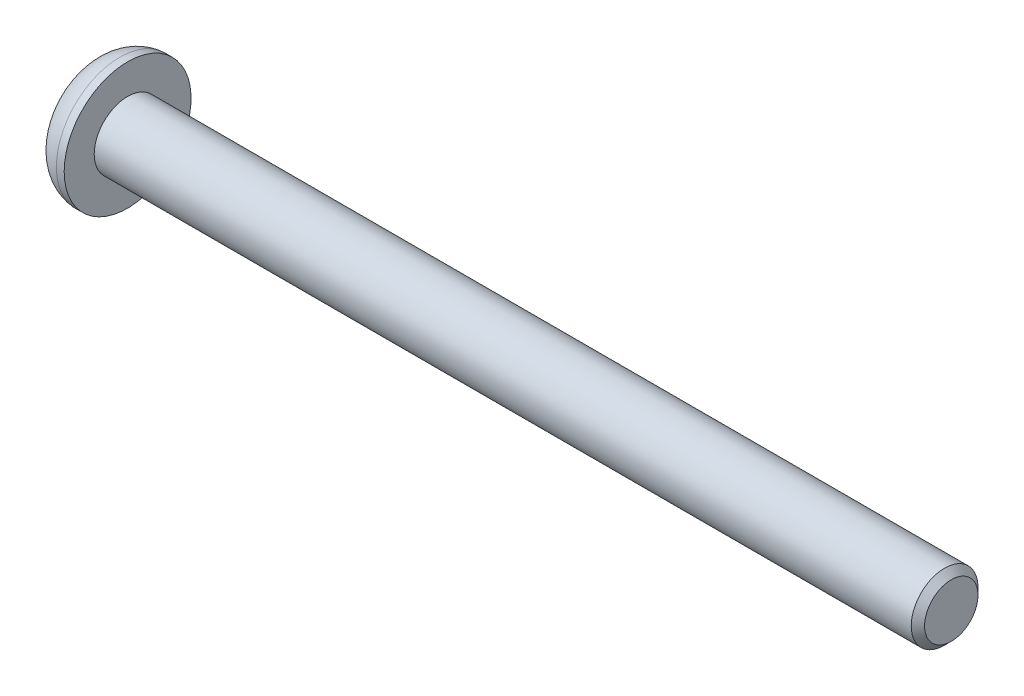
ISO-10303-21;
HEADER;
FILE_DESCRIPTION(('STEP AP214'),'2;1');
FILE_NAME('part.step','',(''),(''),'','','');
FILE_SCHEMA(('AUTOMOTIVE_DESIGN { 1 0 10303 214 1 1 1 1 }'));
ENDSEC;
DATA;
#1=APPLICATION_CONTEXT('core data for automotive mechanical design processes');
#2=APPLICATION_PROTOCOL_DEFINITION('international standard','automotive_design',2000,#1);
#3=PRODUCT_CONTEXT('',#1,'mechanical');
#4=PRODUCT('Part','Part','',(#3));
#5=PRODUCT_RELATED_PRODUCT_CATEGORY('part','',(#4));
#6=PRODUCT_DEFINITION_FORMATION('','',#4);
#7=PRODUCT_DEFINITION_CONTEXT('part definition',#1,'design');
#8=PRODUCT_DEFINITION('design','',#6,#7);
#9=PRODUCT_DEFINITION_SHAPE('','',#8);
#10=(LENGTH_UNIT() NAMED_UNIT(*) SI_UNIT(.MILLI.,.METRE.));
#11=(NAMED_UNIT(*) PLANE_ANGLE_UNIT() SI_UNIT($,.RADIAN.));
#12=(NAMED_UNIT(*) SI_UNIT($,.STERADIAN.) SOLID_ANGLE_UNIT());
#13=UNCERTAINTY_MEASURE_WITH_UNIT(LENGTH_MEASURE(1.E-05),#10,'distance_accuracy_value','');
#14=(GEOMETRIC_REPRESENTATION_CONTEXT(3) GLOBAL_UNCERTAINTY_ASSIGNED_CONTEXT((#13)) GLOBAL_UNIT_ASSIGNED_CONTEXT((#10,
#11,#12)) REPRESENTATION_CONTEXT('',''));
#15=CARTESIAN_POINT('',(0.,0.,0.));
#16=DIRECTION('',(0.,0.,1.));
#17=DIRECTION('',(1.,0.,0.));
#18=AXIS2_PLACEMENT_3D('',#15,#16,#17);
#19=CARTESIAN_POINT('',(-17.8951523683545,0.,0.));
#20=DIRECTION('',(1.,0.,0.));
#21=DIRECTION('',(0.,0.,-1.));
#22=AXIS2_PLACEMENT_3D('',#19,#20,#21);
#23=PLANE('',#22);
#24=DIRECTION('',(0.,-0.5,-0.866025403784439));
#25=VECTOR('',#24,1.);
#26=CARTESIAN_POINT('',(-17.8951523683545,1.15470053837925,0.));
#27=LINE('',#26,#25);
#28=CARTESIAN_POINT('',(-17.8951523683545,1.15470053837925,0.));
#29=VERTEX_POINT('',#28);
#30=CARTESIAN_POINT('',(-17.8951523683545,0.577350269189626,-1.));
#31=VERTEX_POINT('',#30);
#32=EDGE_CURVE('E127',#29,#31,#27,.T.);
#33=ORIENTED_EDGE('',*,*,#32,.F.);
#34=DIRECTION('',(0.,0.5,-0.866025403784439));
#35=VECTOR('',#34,1.);
#36=CARTESIAN_POINT('',(-17.8951523683545,0.577350269189626,1.));
#37=LINE('',#36,#35);
#38=CARTESIAN_POINT('',(-17.8951523683545,0.577350269189626,1.));
#39=VERTEX_POINT('',#38);
#40=EDGE_CURVE('E53',#39,#29,#37,.T.);
#41=ORIENTED_EDGE('',*,*,#40,.F.);
#42=DIRECTION('',(0.,1.,0.));
#43=VECTOR('',#42,1.);
#44=CARTESIAN_POINT('',(-17.8951523683545,-0.577350269189626,1.));
#45=LINE('',#44,#43);
#46=CARTESIAN_POINT('',(-17.8951523683545,-0.577350269189626,1.));
#47=VERTEX_POINT('',#46);
#48=EDGE_CURVE('E136',#47,#39,#45,.T.);
#49=ORIENTED_EDGE('',*,*,#48,.F.);
#50=DIRECTION('',(0.,0.5,0.866025403784439));
#51=VECTOR('',#50,1.);
#52=CARTESIAN_POINT('',(-17.8951523683545,-1.15470053837925,0.));
#53=LINE('',#52,#51);
#54=CARTESIAN_POINT('',(-17.8951523683545,-1.15470053837925,0.));
#55=VERTEX_POINT('',#54);
#56=EDGE_CURVE('E134',#55,#47,#53,.T.);
#57=ORIENTED_EDGE('',*,*,#56,.F.);
#58=DIRECTION('',(0.,-0.5,0.866025403784439));
#59=VECTOR('',#58,1.);
#60=CARTESIAN_POINT('',(-17.8951523683545,-0.577350269189626,-1.));
#61=LINE('',#60,#59);
#62=CARTESIAN_POINT('',(-17.8951523683545,-0.577350269189626,-1.));
#63=VERTEX_POINT('',#62);
#64=EDGE_CURVE('E101',#63,#55,#61,.T.);
#65=ORIENTED_EDGE('',*,*,#64,.F.);
#66=DIRECTION('',(0.,-1.,0.));
#67=VECTOR('',#66,1.);
#68=CARTESIAN_POINT('',(-17.8951523683545,0.577350269189626,-1.));
#69=LINE('',#68,#67);
#70=EDGE_CURVE('E130',#31,#63,#69,.T.);
#71=ORIENTED_EDGE('',*,*,#70,.F.);
#72=EDGE_LOOP('',(#33,#41,#49,#57,#65,#71));
#73=FACE_BOUND('',#72,.T.);
#74=CARTESIAN_POINT('',(-17.8951523683545,0.,0.));
#75=DIRECTION('',(-1.,0.,0.));
#76=DIRECTION('',(0.,0.,1.));
#77=AXIS2_PLACEMENT_3D('',#74,#75,#76);
#78=CIRCLE('',#77,1.425);
#79=CARTESIAN_POINT('',(-17.8951523683545,0.,1.425));
#80=VERTEX_POINT('',#79);
#81=EDGE_CURVE('E11',#80,#80,#78,.T.);
#82=ORIENTED_EDGE('',*,*,#81,.T.);
#83=EDGE_LOOP('',(#82));
#84=FACE_BOUND('',#83,.T.);
#85=ADVANCED_FACE('F39',(#73,#84),#23,.F.);
#86=CARTESIAN_POINT('',(-16.4641427529699,0.,0.));
#87=DIRECTION('',(-1.,0.,0.));
#88=DIRECTION('',(0.,0.,1.));
#89=AXIS2_PLACEMENT_3D('',#86,#87,#88);
#90=DEGENERATE_TOROIDAL_SURFACE('',#89,1.425,1.43100961538462,.T.);
#91=ORIENTED_EDGE('',*,*,#81,.F.);
#92=EDGE_LOOP('',(#91));
#93=FACE_BOUND('',#92,.T.);
#94=CARTESIAN_POINT('',(-16.5951523683545,0.,0.));
#95=DIRECTION('',(-1.,0.,0.));
#96=DIRECTION('',(0.,0.,1.));
#97=AXIS2_PLACEMENT_3D('',#94,#95,#96);
#98=CIRCLE('',#97,2.85);
#99=CARTESIAN_POINT('',(-16.5951523683545,0.,2.85));
#100=VERTEX_POINT('',#99);
#101=EDGE_CURVE('E46',#100,#100,#98,.T.);
#102=ORIENTED_EDGE('',*,*,#101,.T.);
#103=EDGE_LOOP('',(#102));
#104=FACE_BOUND('',#103,.T.);
#105=ADVANCED_FACE('F159',(#93,#104),#90,.T.);
#106=CARTESIAN_POINT('',(-8.74874301025164,0.,0.));
#107=DIRECTION('',(-1.,0.,0.));
#108=DIRECTION('',(0.,0.,1.));
#109=AXIS2_PLACEMENT_3D('',#106,#107,#108);
#110=CYLINDRICAL_SURFACE('',#109,2.85);
#111=ORIENTED_EDGE('',*,*,#101,.F.);
#112=EDGE_LOOP('',(#111));
#113=FACE_BOUND('',#112,.T.);
#114=CARTESIAN_POINT('',(-16.2451523683545,0.,0.));
#115=DIRECTION('',(-1.,0.,0.));
#116=DIRECTION('',(0.,0.,1.));
#117=AXIS2_PLACEMENT_3D('',#114,#115,#116);
#118=CIRCLE('',#117,2.85);
#119=CARTESIAN_POINT('',(-16.2451523683545,0.,2.85));
#120=VERTEX_POINT('',#119);
#121=EDGE_CURVE('E154',#120,#120,#118,.T.);
#122=ORIENTED_EDGE('',*,*,#121,.T.);
#123=EDGE_LOOP('',(#122));
#124=FACE_BOUND('',#123,.T.);
#125=ADVANCED_FACE('F161',(#113,#124),#110,.T.);
#126=CARTESIAN_POINT('',(-16.2451523683545,2.85,0.));
#127=DIRECTION('',(-1.,0.,0.));
#128=DIRECTION('',(0.,0.,1.));
#129=AXIS2_PLACEMENT_3D('',#126,#127,#128);
#130=PLANE('',#129);
#131=ORIENTED_EDGE('',*,*,#121,.F.);
#132=EDGE_LOOP('',(#131));
#133=FACE_BOUND('',#132,.T.);
#134=CARTESIAN_POINT('',(-16.2451523683545,0.,0.));
#135=DIRECTION('',(-1.,0.,0.));
#136=DIRECTION('',(0.,0.,1.));
#137=AXIS2_PLACEMENT_3D('',#134,#135,#136);
#138=CIRCLE('',#137,1.5);
#139=CARTESIAN_POINT('',(-16.2451523683545,0.,1.5));
#140=VERTEX_POINT('',#139);
#141=EDGE_CURVE('E151',#140,#140,#138,.T.);
#142=ORIENTED_EDGE('',*,*,#141,.T.);
#143=EDGE_LOOP('',(#142));
#144=FACE_BOUND('',#143,.T.);
#145=ADVANCED_FACE('F164',(#133,#144),#130,.F.);
#146=CARTESIAN_POINT('',(-8.74874301025164,0.,0.));
#147=DIRECTION('',(-1.,0.,0.));
#148=DIRECTION('',(0.,0.,1.));
#149=AXIS2_PLACEMENT_3D('',#146,#147,#148);
#150=CYLINDRICAL_SURFACE('',#149,1.5);
#151=ORIENTED_EDGE('',*,*,#141,.F.);
#152=EDGE_LOOP('',(#151));
#153=FACE_BOUND('',#152,.T.);
#154=CARTESIAN_POINT('',(20.4548476316455,0.,0.));
#155=DIRECTION('',(-1.,0.,0.));
#156=DIRECTION('',(0.,0.,1.));
#157=AXIS2_PLACEMENT_3D('',#154,#155,#156);
#158=CIRCLE('',#157,1.5);
#159=CARTESIAN_POINT('',(20.4548476316455,0.,1.5));
#160=VERTEX_POINT('',#159);
#161=EDGE_CURVE('E148',#160,#160,#158,.T.);
#162=ORIENTED_EDGE('',*,*,#161,.T.);
#163=EDGE_LOOP('',(#162));
#164=FACE_BOUND('',#163,.T.);
#165=ADVANCED_FACE('F170',(#153,#164),#150,.T.);
#166=CARTESIAN_POINT('',(20.7548476316455,0.,0.));
#167=DIRECTION('',(-1.,0.,0.));
#168=DIRECTION('',(0.,0.,1.));
#169=AXIS2_PLACEMENT_3D('',#166,#167,#168);
#170=CONICAL_SURFACE('',#169,1.2,0.78539816339745);
#171=ORIENTED_EDGE('',*,*,#161,.F.);
#172=EDGE_LOOP('',(#171));
#173=FACE_BOUND('',#172,.T.);
#174=CARTESIAN_POINT('',(20.7548476316455,0.,0.));
#175=DIRECTION('',(-1.,0.,0.));
#176=DIRECTION('',(0.,0.,1.));
#177=AXIS2_PLACEMENT_3D('',#174,#175,#176);
#178=CIRCLE('',#177,1.2);
#179=CARTESIAN_POINT('',(20.7548476316455,0.,1.2));
#180=VERTEX_POINT('',#179);
#181=EDGE_CURVE('E140',#180,#180,#178,.T.);
#182=ORIENTED_EDGE('',*,*,#181,.T.);
#183=EDGE_LOOP('',(#182));
#184=FACE_BOUND('',#183,.T.);
#185=ADVANCED_FACE('F176',(#173,#184),#170,.T.);
#186=CARTESIAN_POINT('',(20.7548476316455,1.2,0.));
#187=DIRECTION('',(-1.,0.,0.));
#188=DIRECTION('',(0.,0.,1.));
#189=AXIS2_PLACEMENT_3D('',#186,#187,#188);
#190=PLANE('',#189);
#191=ORIENTED_EDGE('',*,*,#181,.F.);
#192=EDGE_LOOP('',(#191));
#193=FACE_BOUND('',#192,.T.);
#194=ADVANCED_FACE('F182',(#193),#190,.F.);
#195=CARTESIAN_POINT('',(-16.8951523683545,0.577350269189626,1.));
#196=DIRECTION('',(0.,0.866025403784439,0.5));
#197=DIRECTION('',(0.,-0.5,0.866025403784439));
#198=AXIS2_PLACEMENT_3D('',#195,#196,#197);
#199=PLANE('',#198);
#200=ORIENTED_EDGE('',*,*,#40,.T.);
#201=DIRECTION('',(-1.,0.,0.));
#202=VECTOR('',#201,1.);
#203=CARTESIAN_POINT('',(-16.8951523683545,1.15470053837925,0.));
#204=LINE('',#203,#202);
#205=CARTESIAN_POINT('',(-16.8951523683545,1.15470053837925,0.));
#206=VERTEX_POINT('',#205);
#207=EDGE_CURVE('E83',#206,#29,#204,.T.);
#208=ORIENTED_EDGE('',*,*,#207,.F.);
#209=DIRECTION('',(0.,0.5,-0.866025403784439));
#210=VECTOR('',#209,1.);
#211=CARTESIAN_POINT('',(-16.8951523683545,0.577350269189626,1.));
#212=LINE('',#211,#210);
#213=CARTESIAN_POINT('',(-16.8951523683545,0.577350269189626,1.));
#214=VERTEX_POINT('',#213);
#215=EDGE_CURVE('E138',#214,#206,#212,.T.);
#216=ORIENTED_EDGE('',*,*,#215,.F.);
#217=DIRECTION('',(-1.,0.,0.));
#218=VECTOR('',#217,1.);
#219=CARTESIAN_POINT('',(-16.8951523683545,0.577350269189626,1.));
#220=LINE('',#219,#218);
#221=EDGE_CURVE('E61',#214,#39,#220,.T.);
#222=ORIENTED_EDGE('',*,*,#221,.T.);
#223=EDGE_LOOP('',(#200,#208,#216,#222));
#224=FACE_BOUND('',#223,.T.);
#225=ADVANCED_FACE('F187',(#224),#199,.F.);
#226=CARTESIAN_POINT('',(-16.8951523683545,-0.577350269189626,1.));
#227=DIRECTION('',(0.,0.,1.));
#228=DIRECTION('',(0.,-1.,0.));
#229=AXIS2_PLACEMENT_3D('',#226,#227,#228);
#230=PLANE('',#229);
#231=ORIENTED_EDGE('',*,*,#48,.T.);
#232=ORIENTED_EDGE('',*,*,#221,.F.);
#233=DIRECTION('',(0.,1.,0.));
#234=VECTOR('',#233,1.);
#235=CARTESIAN_POINT('',(-16.8951523683545,-0.577350269189626,1.));
#236=LINE('',#235,#234);
#237=CARTESIAN_POINT('',(-16.8951523683545,-0.577350269189626,1.));
#238=VERTEX_POINT('',#237);
#239=EDGE_CURVE('E113',#238,#214,#236,.T.);
#240=ORIENTED_EDGE('',*,*,#239,.F.);
#241=DIRECTION('',(-1.,0.,0.));
#242=VECTOR('',#241,1.);
#243=CARTESIAN_POINT('',(-16.8951523683545,-0.577350269189626,1.));
#244=LINE('',#243,#242);
#245=EDGE_CURVE('E105',#238,#47,#244,.T.);
#246=ORIENTED_EDGE('',*,*,#245,.T.);
#247=EDGE_LOOP('',(#231,#232,#240,#246));
#248=FACE_BOUND('',#247,.T.);
#249=ADVANCED_FACE('F192',(#248),#230,.F.);
#250=CARTESIAN_POINT('',(-16.8951523683545,-1.15470053837925,0.));
#251=DIRECTION('',(0.,-0.866025403784439,0.5));
#252=DIRECTION('',(0.,-0.5,-0.866025403784439));
#253=AXIS2_PLACEMENT_3D('',#250,#251,#252);
#254=PLANE('',#253);
#255=ORIENTED_EDGE('',*,*,#56,.T.);
#256=ORIENTED_EDGE('',*,*,#245,.F.);
#257=DIRECTION('',(0.,0.5,0.866025403784439));
#258=VECTOR('',#257,1.);
#259=CARTESIAN_POINT('',(-16.8951523683545,-1.15470053837925,0.));
#260=LINE('',#259,#258);
#261=CARTESIAN_POINT('',(-16.8951523683545,-1.15470053837925,0.));
#262=VERTEX_POINT('',#261);
#263=EDGE_CURVE('E109',#262,#238,#260,.T.);
#264=ORIENTED_EDGE('',*,*,#263,.F.);
#265=DIRECTION('',(-1.,0.,0.));
#266=VECTOR('',#265,1.);
#267=CARTESIAN_POINT('',(-16.8951523683545,-1.15470053837925,0.));
#268=LINE('',#267,#266);
#269=EDGE_CURVE('E94',#262,#55,#268,.T.);
#270=ORIENTED_EDGE('',*,*,#269,.T.);
#271=EDGE_LOOP('',(#255,#256,#264,#270));
#272=FACE_BOUND('',#271,.T.);
#273=ADVANCED_FACE('F110',(#272),#254,.F.);
#274=CARTESIAN_POINT('',(-16.8951523683545,-0.577350269189626,-1.));
#275=DIRECTION('',(0.,-0.866025403784439,-0.5));
#276=DIRECTION('',(0.,0.5,-0.866025403784439));
#277=AXIS2_PLACEMENT_3D('',#274,#275,#276);
#278=PLANE('',#277);
#279=ORIENTED_EDGE('',*,*,#64,.T.);
#280=ORIENTED_EDGE('',*,*,#269,.F.);
#281=DIRECTION('',(0.,-0.5,0.866025403784439));
#282=VECTOR('',#281,1.);
#283=CARTESIAN_POINT('',(-16.8951523683545,-0.577350269189626,-1.));
#284=LINE('',#283,#282);
#285=CARTESIAN_POINT('',(-16.8951523683545,-0.577350269189626,-1.));
#286=VERTEX_POINT('',#285);
#287=EDGE_CURVE('E98',#286,#262,#284,.T.);
#288=ORIENTED_EDGE('',*,*,#287,.F.);
#289=DIRECTION('',(-1.,0.,0.));
#290=VECTOR('',#289,1.);
#291=CARTESIAN_POINT('',(-16.8951523683545,-0.577350269189626,-1.));
#292=LINE('',#291,#290);
#293=EDGE_CURVE('E106',#286,#63,#292,.T.);
#294=ORIENTED_EDGE('',*,*,#293,.T.);
#295=EDGE_LOOP('',(#279,#280,#288,#294));
#296=FACE_BOUND('',#295,.T.);
#297=ADVANCED_FACE('F96',(#296),#278,.F.);
#298=CARTESIAN_POINT('',(-16.8951523683545,0.577350269189626,-1.));
#299=DIRECTION('',(0.,0.,-1.));
#300=DIRECTION('',(-1.,0.,0.));
#301=AXIS2_PLACEMENT_3D('',#298,#299,#300);
#302=PLANE('',#301);
#303=ORIENTED_EDGE('',*,*,#70,.T.);
#304=ORIENTED_EDGE('',*,*,#293,.F.);
#305=DIRECTION('',(0.,-1.,0.));
#306=VECTOR('',#305,1.);
#307=CARTESIAN_POINT('',(-16.8951523683545,0.577350269189626,-1.));
#308=LINE('',#307,#306);
#309=CARTESIAN_POINT('',(-16.8951523683545,0.577350269189626,-1.));
#310=VERTEX_POINT('',#309);
#311=EDGE_CURVE('E119',#310,#286,#308,.T.);
#312=ORIENTED_EDGE('',*,*,#311,.F.);
#313=DIRECTION('',(-1.,0.,0.));
#314=VECTOR('',#313,1.);
#315=CARTESIAN_POINT('',(-16.8951523683545,0.577350269189626,-1.));
#316=LINE('',#315,#314);
#317=EDGE_CURVE('E143',#310,#31,#316,.T.);
#318=ORIENTED_EDGE('',*,*,#317,.T.);
#319=EDGE_LOOP('',(#303,#304,#312,#318));
#320=FACE_BOUND('',#319,.T.);
#321=ADVANCED_FACE('F218',(#320),#302,.F.);
#322=CARTESIAN_POINT('',(-16.8951523683545,1.15470053837925,0.));
#323=DIRECTION('',(0.,0.866025403784439,-0.5));
#324=DIRECTION('',(0.,0.5,0.866025403784439));
#325=AXIS2_PLACEMENT_3D('',#322,#323,#324);
#326=PLANE('',#325);
#327=ORIENTED_EDGE('',*,*,#32,.T.);
#328=ORIENTED_EDGE('',*,*,#317,.F.);
#329=DIRECTION('',(0.,-0.5,-0.866025403784439));
#330=VECTOR('',#329,1.);
#331=CARTESIAN_POINT('',(-16.8951523683545,1.15470053837925,0.));
#332=LINE('',#331,#330);
#333=EDGE_CURVE('E121',#206,#310,#332,.T.);
#334=ORIENTED_EDGE('',*,*,#333,.F.);
#335=ORIENTED_EDGE('',*,*,#207,.T.);
#336=EDGE_LOOP('',(#327,#328,#334,#335));
#337=FACE_BOUND('',#336,.T.);
#338=ADVANCED_FACE('F206',(#337),#326,.F.);
#339=CARTESIAN_POINT('',(-16.8951523683545,0.,0.));
#340=DIRECTION('',(-1.,0.,0.));
#341=DIRECTION('',(0.,0.,1.));
#342=AXIS2_PLACEMENT_3D('',#339,#340,#341);
#343=PLANE('',#342);
#344=ORIENTED_EDGE('',*,*,#215,.T.);
#345=ORIENTED_EDGE('',*,*,#333,.T.);
#346=ORIENTED_EDGE('',*,*,#311,.T.);
#347=ORIENTED_EDGE('',*,*,#287,.T.);
#348=ORIENTED_EDGE('',*,*,#263,.T.);
#349=ORIENTED_EDGE('',*,*,#239,.T.);
#350=EDGE_LOOP('',(#344,#345,#346,#347,#348,#349));
#351=FACE_BOUND('',#350,.T.);
#352=ADVANCED_FACE('F116',(#351),#343,.T.);
#353=CLOSED_SHELL('',(#85,#105,#125,#145,#165,#185,#194,#225,#249,#273,#297,#321,#338,#352));
#354=MANIFOLD_SOLID_BREP('B2',#353);
#355=ADVANCED_BREP_SHAPE_REPRESENTATION('',(#18,#354),#14);
#356=SHAPE_DEFINITION_REPRESENTATION(#9,#355);
ENDSEC;
END-ISO-10303-21;
